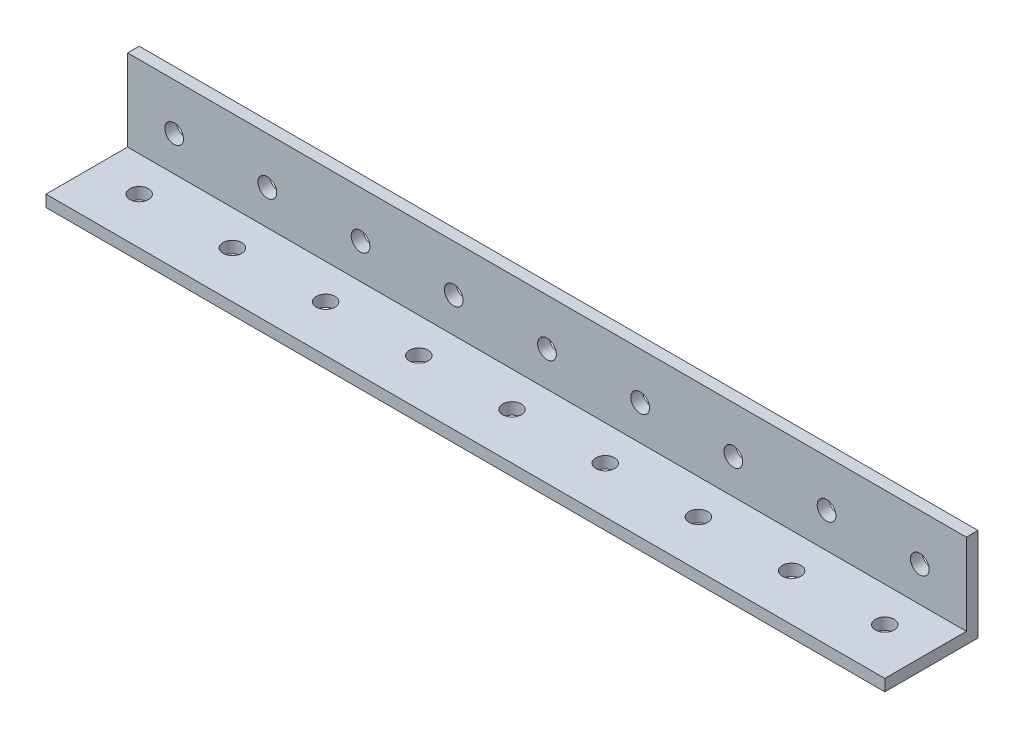
ISO-10303-21;
HEADER;
FILE_DESCRIPTION(('STEP AP214'),'2;1');
FILE_NAME('part.step','',(''),(''),'','','');
FILE_SCHEMA(('AUTOMOTIVE_DESIGN { 1 0 10303 214 1 1 1 1 }'));
ENDSEC;
DATA;
#1=APPLICATION_CONTEXT('core data for automotive mechanical design processes');
#2=APPLICATION_PROTOCOL_DEFINITION('international standard','automotive_design',2000,#1);
#3=PRODUCT_CONTEXT('',#1,'mechanical');
#4=PRODUCT('Part','Part','',(#3));
#5=PRODUCT_RELATED_PRODUCT_CATEGORY('part','',(#4));
#6=PRODUCT_DEFINITION_FORMATION('','',#4);
#7=PRODUCT_DEFINITION_CONTEXT('part definition',#1,'design');
#8=PRODUCT_DEFINITION('design','',#6,#7);
#9=PRODUCT_DEFINITION_SHAPE('','',#8);
#10=(LENGTH_UNIT() NAMED_UNIT(*) SI_UNIT(.MILLI.,.METRE.));
#11=(NAMED_UNIT(*) PLANE_ANGLE_UNIT() SI_UNIT($,.RADIAN.));
#12=(NAMED_UNIT(*) SI_UNIT($,.STERADIAN.) SOLID_ANGLE_UNIT());
#13=UNCERTAINTY_MEASURE_WITH_UNIT(LENGTH_MEASURE(1.E-05),#10,'distance_accuracy_value','');
#14=(GEOMETRIC_REPRESENTATION_CONTEXT(3) GLOBAL_UNCERTAINTY_ASSIGNED_CONTEXT((#13)) GLOBAL_UNIT_ASSIGNED_CONTEXT((#10,
#11,#12)) REPRESENTATION_CONTEXT('',''));
#15=CARTESIAN_POINT('',(0.,0.,0.));
#16=DIRECTION('',(0.,0.,1.));
#17=DIRECTION('',(1.,0.,0.));
#18=AXIS2_PLACEMENT_3D('',#15,#16,#17);
#19=CARTESIAN_POINT('',(12.7,88.9,25.4));
#20=DIRECTION('',(0.,0.,-1.));
#21=DIRECTION('',(-1.,0.,0.));
#22=AXIS2_PLACEMENT_3D('',#19,#20,#21);
#23=CYLINDRICAL_SURFACE('',#22,2.5527);
#24=CARTESIAN_POINT('',(12.7,88.9,0.));
#25=DIRECTION('',(0.,0.,1.));
#26=DIRECTION('',(1.,0.,0.));
#27=AXIS2_PLACEMENT_3D('',#24,#25,#26);
#28=CIRCLE('',#27,2.5527);
#29=CARTESIAN_POINT('',(15.2527,88.9,0.));
#30=VERTEX_POINT('',#29);
#31=EDGE_CURVE('E265',#30,#30,#28,.T.);
#32=ORIENTED_EDGE('',*,*,#31,.F.);
#33=EDGE_LOOP('',(#32));
#34=FACE_BOUND('',#33,.T.);
#35=CARTESIAN_POINT('',(12.7,88.9,3.175));
#36=DIRECTION('',(0.,0.,-1.));
#37=DIRECTION('',(1.,0.,0.));
#38=AXIS2_PLACEMENT_3D('',#35,#36,#37);
#39=CIRCLE('',#38,2.5527);
#40=CARTESIAN_POINT('',(15.2527,88.9,3.175));
#41=VERTEX_POINT('',#40);
#42=EDGE_CURVE('E403',#41,#41,#39,.T.);
#43=ORIENTED_EDGE('',*,*,#42,.F.);
#44=EDGE_LOOP('',(#43));
#45=FACE_BOUND('',#44,.T.);
#46=ADVANCED_FACE('F17',(#34,#45),#23,.F.);
#47=CARTESIAN_POINT('',(38.1,88.9,25.4));
#48=DIRECTION('',(0.,0.,-1.));
#49=DIRECTION('',(-1.,0.,0.));
#50=AXIS2_PLACEMENT_3D('',#47,#48,#49);
#51=CYLINDRICAL_SURFACE('',#50,2.5527);
#52=CARTESIAN_POINT('',(38.1,88.9,0.));
#53=DIRECTION('',(0.,0.,1.));
#54=DIRECTION('',(1.,0.,0.));
#55=AXIS2_PLACEMENT_3D('',#52,#53,#54);
#56=CIRCLE('',#55,2.5527);
#57=CARTESIAN_POINT('',(40.6527,88.9,0.));
#58=VERTEX_POINT('',#57);
#59=EDGE_CURVE('E261',#58,#58,#56,.T.);
#60=ORIENTED_EDGE('',*,*,#59,.F.);
#61=EDGE_LOOP('',(#60));
#62=FACE_BOUND('',#61,.T.);
#63=CARTESIAN_POINT('',(38.1,88.9,3.175));
#64=DIRECTION('',(0.,0.,-1.));
#65=DIRECTION('',(1.,0.,0.));
#66=AXIS2_PLACEMENT_3D('',#63,#64,#65);
#67=CIRCLE('',#66,2.5527);
#68=CARTESIAN_POINT('',(40.6527,88.9,3.175));
#69=VERTEX_POINT('',#68);
#70=EDGE_CURVE('E400',#69,#69,#67,.T.);
#71=ORIENTED_EDGE('',*,*,#70,.F.);
#72=EDGE_LOOP('',(#71));
#73=FACE_BOUND('',#72,.T.);
#74=ADVANCED_FACE('F415',(#62,#73),#51,.F.);
#75=CARTESIAN_POINT('',(63.5,88.9,25.4));
#76=DIRECTION('',(0.,0.,-1.));
#77=DIRECTION('',(-1.,0.,0.));
#78=AXIS2_PLACEMENT_3D('',#75,#76,#77);
#79=CYLINDRICAL_SURFACE('',#78,2.5527);
#80=CARTESIAN_POINT('',(63.5,88.9,0.));
#81=DIRECTION('',(0.,0.,1.));
#82=DIRECTION('',(1.,0.,0.));
#83=AXIS2_PLACEMENT_3D('',#80,#81,#82);
#84=CIRCLE('',#83,2.5527);
#85=CARTESIAN_POINT('',(66.0527,88.9,0.));
#86=VERTEX_POINT('',#85);
#87=EDGE_CURVE('E264',#86,#86,#84,.T.);
#88=ORIENTED_EDGE('',*,*,#87,.F.);
#89=EDGE_LOOP('',(#88));
#90=FACE_BOUND('',#89,.T.);
#91=CARTESIAN_POINT('',(63.5,88.9,3.175));
#92=DIRECTION('',(0.,0.,-1.));
#93=DIRECTION('',(1.,0.,0.));
#94=AXIS2_PLACEMENT_3D('',#91,#92,#93);
#95=CIRCLE('',#94,2.5527);
#96=CARTESIAN_POINT('',(66.0527,88.9,3.175));
#97=VERTEX_POINT('',#96);
#98=EDGE_CURVE('E397',#97,#97,#95,.T.);
#99=ORIENTED_EDGE('',*,*,#98,.F.);
#100=EDGE_LOOP('',(#99));
#101=FACE_BOUND('',#100,.T.);
#102=ADVANCED_FACE('F19',(#90,#101),#79,.F.);
#103=CARTESIAN_POINT('',(88.9,88.9,25.4));
#104=DIRECTION('',(0.,0.,-1.));
#105=DIRECTION('',(-1.,0.,0.));
#106=AXIS2_PLACEMENT_3D('',#103,#104,#105);
#107=CYLINDRICAL_SURFACE('',#106,2.5527);
#108=CARTESIAN_POINT('',(88.9,88.9,0.));
#109=DIRECTION('',(0.,0.,1.));
#110=DIRECTION('',(1.,0.,0.));
#111=AXIS2_PLACEMENT_3D('',#108,#109,#110);
#112=CIRCLE('',#111,2.5527);
#113=CARTESIAN_POINT('',(91.4527,88.9,0.));
#114=VERTEX_POINT('',#113);
#115=EDGE_CURVE('E270',#114,#114,#112,.T.);
#116=ORIENTED_EDGE('',*,*,#115,.F.);
#117=EDGE_LOOP('',(#116));
#118=FACE_BOUND('',#117,.T.);
#119=CARTESIAN_POINT('',(88.9,88.9,3.175));
#120=DIRECTION('',(0.,0.,-1.));
#121=DIRECTION('',(1.,0.,0.));
#122=AXIS2_PLACEMENT_3D('',#119,#120,#121);
#123=CIRCLE('',#122,2.5527);
#124=CARTESIAN_POINT('',(91.4527,88.9,3.175));
#125=VERTEX_POINT('',#124);
#126=EDGE_CURVE('E390',#125,#125,#123,.T.);
#127=ORIENTED_EDGE('',*,*,#126,.F.);
#128=EDGE_LOOP('',(#127));
#129=FACE_BOUND('',#128,.T.);
#130=ADVANCED_FACE('F441',(#118,#129),#107,.F.);
#131=CARTESIAN_POINT('',(114.3,88.9,25.4));
#132=DIRECTION('',(0.,0.,-1.));
#133=DIRECTION('',(-1.,0.,0.));
#134=AXIS2_PLACEMENT_3D('',#131,#132,#133);
#135=CYLINDRICAL_SURFACE('',#134,2.5527);
#136=CARTESIAN_POINT('',(114.3,88.9,0.));
#137=DIRECTION('',(0.,0.,1.));
#138=DIRECTION('',(1.,0.,0.));
#139=AXIS2_PLACEMENT_3D('',#136,#137,#138);
#140=CIRCLE('',#139,2.5527);
#141=CARTESIAN_POINT('',(116.8527,88.9,0.));
#142=VERTEX_POINT('',#141);
#143=EDGE_CURVE('E273',#142,#142,#140,.T.);
#144=ORIENTED_EDGE('',*,*,#143,.F.);
#145=EDGE_LOOP('',(#144));
#146=FACE_BOUND('',#145,.T.);
#147=CARTESIAN_POINT('',(114.3,88.9,3.175));
#148=DIRECTION('',(0.,0.,-1.));
#149=DIRECTION('',(1.,0.,0.));
#150=AXIS2_PLACEMENT_3D('',#147,#148,#149);
#151=CIRCLE('',#150,2.5527);
#152=CARTESIAN_POINT('',(116.8527,88.9,3.175));
#153=VERTEX_POINT('',#152);
#154=EDGE_CURVE('E387',#153,#153,#151,.T.);
#155=ORIENTED_EDGE('',*,*,#154,.F.);
#156=EDGE_LOOP('',(#155));
#157=FACE_BOUND('',#156,.T.);
#158=ADVANCED_FACE('F437',(#146,#157),#135,.F.);
#159=CARTESIAN_POINT('',(139.7,88.9,25.4));
#160=DIRECTION('',(0.,0.,-1.));
#161=DIRECTION('',(-1.,0.,0.));
#162=AXIS2_PLACEMENT_3D('',#159,#160,#161);
#163=CYLINDRICAL_SURFACE('',#162,2.5527);
#164=CARTESIAN_POINT('',(139.7,88.9,0.));
#165=DIRECTION('',(0.,0.,1.));
#166=DIRECTION('',(1.,0.,0.));
#167=AXIS2_PLACEMENT_3D('',#164,#165,#166);
#168=CIRCLE('',#167,2.5527);
#169=CARTESIAN_POINT('',(142.2527,88.9,0.));
#170=VERTEX_POINT('',#169);
#171=EDGE_CURVE('E260',#170,#170,#168,.T.);
#172=ORIENTED_EDGE('',*,*,#171,.F.);
#173=EDGE_LOOP('',(#172));
#174=FACE_BOUND('',#173,.T.);
#175=CARTESIAN_POINT('',(139.7,88.9,3.175));
#176=DIRECTION('',(0.,0.,-1.));
#177=DIRECTION('',(1.,0.,0.));
#178=AXIS2_PLACEMENT_3D('',#175,#176,#177);
#179=CIRCLE('',#178,2.5527);
#180=CARTESIAN_POINT('',(142.2527,88.9,3.175));
#181=VERTEX_POINT('',#180);
#182=EDGE_CURVE('E384',#181,#181,#179,.T.);
#183=ORIENTED_EDGE('',*,*,#182,.F.);
#184=EDGE_LOOP('',(#183));
#185=FACE_BOUND('',#184,.T.);
#186=ADVANCED_FACE('F440',(#174,#185),#163,.F.);
#187=CARTESIAN_POINT('',(165.1,88.9,25.4));
#188=DIRECTION('',(0.,0.,-1.));
#189=DIRECTION('',(-1.,0.,0.));
#190=AXIS2_PLACEMENT_3D('',#187,#188,#189);
#191=CYLINDRICAL_SURFACE('',#190,2.5527);
#192=CARTESIAN_POINT('',(165.1,88.9,0.));
#193=DIRECTION('',(0.,0.,1.));
#194=DIRECTION('',(1.,0.,0.));
#195=AXIS2_PLACEMENT_3D('',#192,#193,#194);
#196=CIRCLE('',#195,2.5527);
#197=CARTESIAN_POINT('',(167.6527,88.9,0.));
#198=VERTEX_POINT('',#197);
#199=EDGE_CURVE('E256',#198,#198,#196,.T.);
#200=ORIENTED_EDGE('',*,*,#199,.F.);
#201=EDGE_LOOP('',(#200));
#202=FACE_BOUND('',#201,.T.);
#203=CARTESIAN_POINT('',(165.1,88.9,3.175));
#204=DIRECTION('',(0.,0.,-1.));
#205=DIRECTION('',(1.,0.,0.));
#206=AXIS2_PLACEMENT_3D('',#203,#204,#205);
#207=CIRCLE('',#206,2.5527);
#208=CARTESIAN_POINT('',(167.6527,88.9,3.175));
#209=VERTEX_POINT('',#208);
#210=EDGE_CURVE('E381',#209,#209,#207,.T.);
#211=ORIENTED_EDGE('',*,*,#210,.F.);
#212=EDGE_LOOP('',(#211));
#213=FACE_BOUND('',#212,.T.);
#214=ADVANCED_FACE('F478',(#202,#213),#191,.F.);
#215=CARTESIAN_POINT('',(190.5,88.9,25.4));
#216=DIRECTION('',(0.,0.,-1.));
#217=DIRECTION('',(-1.,0.,0.));
#218=AXIS2_PLACEMENT_3D('',#215,#216,#217);
#219=CYLINDRICAL_SURFACE('',#218,2.5527);
#220=CARTESIAN_POINT('',(190.5,88.9,0.));
#221=DIRECTION('',(0.,0.,1.));
#222=DIRECTION('',(1.,0.,0.));
#223=AXIS2_PLACEMENT_3D('',#220,#221,#222);
#224=CIRCLE('',#223,2.5527);
#225=CARTESIAN_POINT('',(193.0527,88.9,0.));
#226=VERTEX_POINT('',#225);
#227=EDGE_CURVE('E259',#226,#226,#224,.T.);
#228=ORIENTED_EDGE('',*,*,#227,.F.);
#229=EDGE_LOOP('',(#228));
#230=FACE_BOUND('',#229,.T.);
#231=CARTESIAN_POINT('',(190.5,88.9,3.175));
#232=DIRECTION('',(0.,0.,-1.));
#233=DIRECTION('',(1.,0.,0.));
#234=AXIS2_PLACEMENT_3D('',#231,#232,#233);
#235=CIRCLE('',#234,2.5527);
#236=CARTESIAN_POINT('',(193.0527,88.9,3.175));
#237=VERTEX_POINT('',#236);
#238=EDGE_CURVE('E376',#237,#237,#235,.T.);
#239=ORIENTED_EDGE('',*,*,#238,.F.);
#240=EDGE_LOOP('',(#239));
#241=FACE_BOUND('',#240,.T.);
#242=ADVANCED_FACE('F474',(#230,#241),#219,.F.);
#243=CARTESIAN_POINT('',(215.9,88.9,25.4));
#244=DIRECTION('',(0.,0.,-1.));
#245=DIRECTION('',(-1.,0.,0.));
#246=AXIS2_PLACEMENT_3D('',#243,#244,#245);
#247=CYLINDRICAL_SURFACE('',#246,2.5527);
#248=CARTESIAN_POINT('',(215.9,88.9,0.));
#249=DIRECTION('',(0.,0.,1.));
#250=DIRECTION('',(1.,0.,0.));
#251=AXIS2_PLACEMENT_3D('',#248,#249,#250);
#252=CIRCLE('',#251,2.5527);
#253=CARTESIAN_POINT('',(218.4527,88.9,0.));
#254=VERTEX_POINT('',#253);
#255=EDGE_CURVE('E278',#254,#254,#252,.T.);
#256=ORIENTED_EDGE('',*,*,#255,.F.);
#257=EDGE_LOOP('',(#256));
#258=FACE_BOUND('',#257,.T.);
#259=CARTESIAN_POINT('',(215.9,88.9,3.175));
#260=DIRECTION('',(0.,0.,-1.));
#261=DIRECTION('',(1.,0.,0.));
#262=AXIS2_PLACEMENT_3D('',#259,#260,#261);
#263=CIRCLE('',#262,2.5527);
#264=CARTESIAN_POINT('',(218.4527,88.9,3.175));
#265=VERTEX_POINT('',#264);
#266=EDGE_CURVE('E373',#265,#265,#263,.T.);
#267=ORIENTED_EDGE('',*,*,#266,.F.);
#268=EDGE_LOOP('',(#267));
#269=FACE_BOUND('',#268,.T.);
#270=ADVANCED_FACE('F470',(#258,#269),#247,.F.);
#271=CARTESIAN_POINT('',(12.7,1126.04930693996,12.7));
#272=DIRECTION('',(0.,-1.,0.));
#273=DIRECTION('',(0.,0.,-1.));
#274=AXIS2_PLACEMENT_3D('',#271,#272,#273);
#275=CYLINDRICAL_SURFACE('',#274,2.5527);
#276=CARTESIAN_POINT('',(12.7,79.375,12.7));
#277=DIRECTION('',(0.,-1.,0.));
#278=DIRECTION('',(0.,0.,-1.));
#279=AXIS2_PLACEMENT_3D('',#276,#277,#278);
#280=CIRCLE('',#279,2.5527);
#281=CARTESIAN_POINT('',(12.7,79.375,10.1473));
#282=VERTEX_POINT('',#281);
#283=EDGE_CURVE('E352',#282,#282,#280,.T.);
#284=ORIENTED_EDGE('',*,*,#283,.F.);
#285=EDGE_LOOP('',(#284));
#286=FACE_BOUND('',#285,.T.);
#287=CARTESIAN_POINT('',(12.7,76.2,12.7));
#288=DIRECTION('',(0.,-1.,0.));
#289=DIRECTION('',(0.,0.,-1.));
#290=AXIS2_PLACEMENT_3D('',#287,#288,#289);
#291=CIRCLE('',#290,2.5527);
#292=CARTESIAN_POINT('',(12.7,76.2,10.1473));
#293=VERTEX_POINT('',#292);
#294=EDGE_CURVE('E310',#293,#293,#291,.T.);
#295=ORIENTED_EDGE('',*,*,#294,.T.);
#296=EDGE_LOOP('',(#295));
#297=FACE_BOUND('',#296,.T.);
#298=ADVANCED_FACE('F466',(#286,#297),#275,.F.);
#299=CARTESIAN_POINT('',(38.1,1126.04930693996,12.7));
#300=DIRECTION('',(0.,-1.,0.));
#301=DIRECTION('',(0.,0.,-1.));
#302=AXIS2_PLACEMENT_3D('',#299,#300,#301);
#303=CYLINDRICAL_SURFACE('',#302,2.5527);
#304=CARTESIAN_POINT('',(38.1,79.375,12.7));
#305=DIRECTION('',(0.,-1.,0.));
#306=DIRECTION('',(0.,0.,-1.));
#307=AXIS2_PLACEMENT_3D('',#304,#305,#306);
#308=CIRCLE('',#307,2.5527);
#309=CARTESIAN_POINT('',(38.1,79.375,10.1473));
#310=VERTEX_POINT('',#309);
#311=EDGE_CURVE('E349',#310,#310,#308,.T.);
#312=ORIENTED_EDGE('',*,*,#311,.F.);
#313=EDGE_LOOP('',(#312));
#314=FACE_BOUND('',#313,.T.);
#315=CARTESIAN_POINT('',(38.1,76.2,12.7));
#316=DIRECTION('',(0.,-1.,0.));
#317=DIRECTION('',(0.,0.,-1.));
#318=AXIS2_PLACEMENT_3D('',#315,#316,#317);
#319=CIRCLE('',#318,2.5527);
#320=CARTESIAN_POINT('',(38.1,76.2,10.1473));
#321=VERTEX_POINT('',#320);
#322=EDGE_CURVE('E313',#321,#321,#319,.T.);
#323=ORIENTED_EDGE('',*,*,#322,.T.);
#324=EDGE_LOOP('',(#323));
#325=FACE_BOUND('',#324,.T.);
#326=ADVANCED_FACE('F469',(#314,#325),#303,.F.);
#327=CARTESIAN_POINT('',(63.5,1126.04930693996,12.7));
#328=DIRECTION('',(0.,-1.,0.));
#329=DIRECTION('',(0.,0.,-1.));
#330=AXIS2_PLACEMENT_3D('',#327,#328,#329);
#331=CYLINDRICAL_SURFACE('',#330,2.5527);
#332=CARTESIAN_POINT('',(63.5,79.375,12.7));
#333=DIRECTION('',(0.,-1.,0.));
#334=DIRECTION('',(0.,0.,-1.));
#335=AXIS2_PLACEMENT_3D('',#332,#333,#334);
#336=CIRCLE('',#335,2.5527);
#337=CARTESIAN_POINT('',(63.5,79.375,10.1473));
#338=VERTEX_POINT('',#337);
#339=EDGE_CURVE('E348',#338,#338,#336,.T.);
#340=ORIENTED_EDGE('',*,*,#339,.F.);
#341=EDGE_LOOP('',(#340));
#342=FACE_BOUND('',#341,.T.);
#343=CARTESIAN_POINT('',(63.5,76.2,12.7));
#344=DIRECTION('',(0.,-1.,0.));
#345=DIRECTION('',(0.,0.,-1.));
#346=AXIS2_PLACEMENT_3D('',#343,#344,#345);
#347=CIRCLE('',#346,2.5527);
#348=CARTESIAN_POINT('',(63.5,76.2,10.1473));
#349=VERTEX_POINT('',#348);
#350=EDGE_CURVE('E316',#349,#349,#347,.T.);
#351=ORIENTED_EDGE('',*,*,#350,.T.);
#352=EDGE_LOOP('',(#351));
#353=FACE_BOUND('',#352,.T.);
#354=ADVANCED_FACE('F427',(#342,#353),#331,.F.);
#355=CARTESIAN_POINT('',(88.9,1126.04930693996,12.7));
#356=DIRECTION('',(0.,-1.,0.));
#357=DIRECTION('',(0.,0.,-1.));
#358=AXIS2_PLACEMENT_3D('',#355,#356,#357);
#359=CYLINDRICAL_SURFACE('',#358,2.5527);
#360=CARTESIAN_POINT('',(88.9,79.375,12.7));
#361=DIRECTION('',(0.,-1.,0.));
#362=DIRECTION('',(0.,0.,-1.));
#363=AXIS2_PLACEMENT_3D('',#360,#361,#362);
#364=CIRCLE('',#363,2.5527);
#365=CARTESIAN_POINT('',(88.9,79.375,10.1473));
#366=VERTEX_POINT('',#365);
#367=EDGE_CURVE('E344',#366,#366,#364,.T.);
#368=ORIENTED_EDGE('',*,*,#367,.F.);
#369=EDGE_LOOP('',(#368));
#370=FACE_BOUND('',#369,.T.);
#371=CARTESIAN_POINT('',(88.9,76.2,12.7));
#372=DIRECTION('',(0.,-1.,0.));
#373=DIRECTION('',(0.,0.,-1.));
#374=AXIS2_PLACEMENT_3D('',#371,#372,#373);
#375=CIRCLE('',#374,2.5527);
#376=CARTESIAN_POINT('',(88.9,76.2,10.1473));
#377=VERTEX_POINT('',#376);
#378=EDGE_CURVE('E318',#377,#377,#375,.T.);
#379=ORIENTED_EDGE('',*,*,#378,.T.);
#380=EDGE_LOOP('',(#379));
#381=FACE_BOUND('',#380,.T.);
#382=ADVANCED_FACE('F459',(#370,#381),#359,.F.);
#383=CARTESIAN_POINT('',(114.3,1126.04930693996,12.7));
#384=DIRECTION('',(0.,-1.,0.));
#385=DIRECTION('',(0.,0.,-1.));
#386=AXIS2_PLACEMENT_3D('',#383,#384,#385);
#387=CYLINDRICAL_SURFACE('',#386,2.5527);
#388=CARTESIAN_POINT('',(114.3,79.375,12.7));
#389=DIRECTION('',(0.,-1.,0.));
#390=DIRECTION('',(0.,0.,-1.));
#391=AXIS2_PLACEMENT_3D('',#388,#389,#390);
#392=CIRCLE('',#391,2.5527);
#393=CARTESIAN_POINT('',(114.3,79.375,10.1473));
#394=VERTEX_POINT('',#393);
#395=EDGE_CURVE('E347',#394,#394,#392,.T.);
#396=ORIENTED_EDGE('',*,*,#395,.F.);
#397=EDGE_LOOP('',(#396));
#398=FACE_BOUND('',#397,.T.);
#399=CARTESIAN_POINT('',(114.3,76.2,12.7));
#400=DIRECTION('',(0.,-1.,0.));
#401=DIRECTION('',(0.,0.,-1.));
#402=AXIS2_PLACEMENT_3D('',#399,#400,#401);
#403=CIRCLE('',#402,2.5527);
#404=CARTESIAN_POINT('',(114.3,76.2,10.1473));
#405=VERTEX_POINT('',#404);
#406=EDGE_CURVE('E319',#405,#405,#403,.T.);
#407=ORIENTED_EDGE('',*,*,#406,.T.);
#408=EDGE_LOOP('',(#407));
#409=FACE_BOUND('',#408,.T.);
#410=ADVANCED_FACE('F457',(#398,#409),#387,.F.);
#411=CARTESIAN_POINT('',(139.7,1126.04930693996,12.7));
#412=DIRECTION('',(0.,-1.,0.));
#413=DIRECTION('',(0.,0.,-1.));
#414=AXIS2_PLACEMENT_3D('',#411,#412,#413);
#415=CYLINDRICAL_SURFACE('',#414,2.5527);
#416=CARTESIAN_POINT('',(139.7,79.375,12.7));
#417=DIRECTION('',(0.,-1.,0.));
#418=DIRECTION('',(0.,0.,-1.));
#419=AXIS2_PLACEMENT_3D('',#416,#417,#418);
#420=CIRCLE('',#419,2.5527);
#421=CARTESIAN_POINT('',(139.7,79.375,10.1473));
#422=VERTEX_POINT('',#421);
#423=EDGE_CURVE('E343',#422,#422,#420,.T.);
#424=ORIENTED_EDGE('',*,*,#423,.F.);
#425=EDGE_LOOP('',(#424));
#426=FACE_BOUND('',#425,.T.);
#427=CARTESIAN_POINT('',(139.7,76.2,12.7));
#428=DIRECTION('',(0.,-1.,0.));
#429=DIRECTION('',(0.,0.,-1.));
#430=AXIS2_PLACEMENT_3D('',#427,#428,#429);
#431=CIRCLE('',#430,2.5527);
#432=CARTESIAN_POINT('',(139.7,76.2,10.1473));
#433=VERTEX_POINT('',#432);
#434=EDGE_CURVE('E244',#433,#433,#431,.T.);
#435=ORIENTED_EDGE('',*,*,#434,.T.);
#436=EDGE_LOOP('',(#435));
#437=FACE_BOUND('',#436,.T.);
#438=ADVANCED_FACE('F450',(#426,#437),#415,.F.);
#439=CARTESIAN_POINT('',(165.1,1126.04930693996,12.7));
#440=DIRECTION('',(0.,-1.,0.));
#441=DIRECTION('',(0.,0.,-1.));
#442=AXIS2_PLACEMENT_3D('',#439,#440,#441);
#443=CYLINDRICAL_SURFACE('',#442,2.5527);
#444=CARTESIAN_POINT('',(165.1,79.375,12.7));
#445=DIRECTION('',(0.,-1.,0.));
#446=DIRECTION('',(0.,0.,-1.));
#447=AXIS2_PLACEMENT_3D('',#444,#445,#446);
#448=CIRCLE('',#447,2.5527);
#449=CARTESIAN_POINT('',(165.1,79.375,10.1473));
#450=VERTEX_POINT('',#449);
#451=EDGE_CURVE('E340',#450,#450,#448,.T.);
#452=ORIENTED_EDGE('',*,*,#451,.F.);
#453=EDGE_LOOP('',(#452));
#454=FACE_BOUND('',#453,.T.);
#455=CARTESIAN_POINT('',(165.1,76.2,12.7));
#456=DIRECTION('',(0.,-1.,0.));
#457=DIRECTION('',(0.,0.,-1.));
#458=AXIS2_PLACEMENT_3D('',#455,#456,#457);
#459=CIRCLE('',#458,2.5527);
#460=CARTESIAN_POINT('',(165.1,76.2,10.1473));
#461=VERTEX_POINT('',#460);
#462=EDGE_CURVE('E236',#461,#461,#459,.T.);
#463=ORIENTED_EDGE('',*,*,#462,.T.);
#464=EDGE_LOOP('',(#463));
#465=FACE_BOUND('',#464,.T.);
#466=ADVANCED_FACE('F447',(#454,#465),#443,.F.);
#467=CARTESIAN_POINT('',(190.5,1126.04930693996,12.7));
#468=DIRECTION('',(0.,-1.,0.));
#469=DIRECTION('',(0.,0.,-1.));
#470=AXIS2_PLACEMENT_3D('',#467,#468,#469);
#471=CYLINDRICAL_SURFACE('',#470,2.5527);
#472=CARTESIAN_POINT('',(190.5,79.375,12.7));
#473=DIRECTION('',(0.,-1.,0.));
#474=DIRECTION('',(0.,0.,-1.));
#475=AXIS2_PLACEMENT_3D('',#472,#473,#474);
#476=CIRCLE('',#475,2.5527);
#477=CARTESIAN_POINT('',(190.5,79.375,10.1473));
#478=VERTEX_POINT('',#477);
#479=EDGE_CURVE('E337',#478,#478,#476,.T.);
#480=ORIENTED_EDGE('',*,*,#479,.F.);
#481=EDGE_LOOP('',(#480));
#482=FACE_BOUND('',#481,.T.);
#483=CARTESIAN_POINT('',(190.5,76.2,12.7));
#484=DIRECTION('',(0.,-1.,0.));
#485=DIRECTION('',(0.,0.,-1.));
#486=AXIS2_PLACEMENT_3D('',#483,#484,#485);
#487=CIRCLE('',#486,2.5527);
#488=CARTESIAN_POINT('',(190.5,76.2,10.1473));
#489=VERTEX_POINT('',#488);
#490=EDGE_CURVE('E231',#489,#489,#487,.T.);
#491=ORIENTED_EDGE('',*,*,#490,.T.);
#492=EDGE_LOOP('',(#491));
#493=FACE_BOUND('',#492,.T.);
#494=ADVANCED_FACE('F232',(#482,#493),#471,.F.);
#495=CARTESIAN_POINT('',(215.9,1126.04930693996,12.7));
#496=DIRECTION('',(0.,-1.,0.));
#497=DIRECTION('',(0.,0.,-1.));
#498=AXIS2_PLACEMENT_3D('',#495,#496,#497);
#499=CYLINDRICAL_SURFACE('',#498,2.5527);
#500=CARTESIAN_POINT('',(215.9,79.375,12.7));
#501=DIRECTION('',(0.,-1.,0.));
#502=DIRECTION('',(0.,0.,-1.));
#503=AXIS2_PLACEMENT_3D('',#500,#501,#502);
#504=CIRCLE('',#503,2.5527);
#505=CARTESIAN_POINT('',(215.9,79.375,10.1473));
#506=VERTEX_POINT('',#505);
#507=EDGE_CURVE('E334',#506,#506,#504,.T.);
#508=ORIENTED_EDGE('',*,*,#507,.F.);
#509=EDGE_LOOP('',(#508));
#510=FACE_BOUND('',#509,.T.);
#511=CARTESIAN_POINT('',(215.9,76.2,12.7));
#512=DIRECTION('',(0.,-1.,0.));
#513=DIRECTION('',(0.,0.,-1.));
#514=AXIS2_PLACEMENT_3D('',#511,#512,#513);
#515=CIRCLE('',#514,2.5527);
#516=CARTESIAN_POINT('',(215.9,76.2,10.1473));
#517=VERTEX_POINT('',#516);
#518=EDGE_CURVE('E235',#517,#517,#515,.T.);
#519=ORIENTED_EDGE('',*,*,#518,.T.);
#520=EDGE_LOOP('',(#519));
#521=FACE_BOUND('',#520,.T.);
#522=ADVANCED_FACE('F443',(#510,#521),#499,.F.);
#523=CARTESIAN_POINT('',(0.,50.8,12.7));
#524=DIRECTION('',(1.,0.,0.));
#525=DIRECTION('',(0.,1.,0.));
#526=AXIS2_PLACEMENT_3D('',#523,#524,#525);
#527=PLANE('',#526);
#528=DIRECTION('',(0.,1.,0.));
#529=VECTOR('',#528,1.);
#530=CARTESIAN_POINT('',(0.,90.4875,3.175));
#531=LINE('',#530,#529);
#532=CARTESIAN_POINT('',(0.,79.375,3.175));
#533=VERTEX_POINT('',#532);
#534=CARTESIAN_POINT('',(0.,101.6,3.175));
#535=VERTEX_POINT('',#534);
#536=EDGE_CURVE('E370',#533,#535,#531,.T.);
#537=ORIENTED_EDGE('',*,*,#536,.T.);
#538=DIRECTION('',(0.,0.,-1.));
#539=VECTOR('',#538,1.);
#540=CARTESIAN_POINT('',(0.,101.6,1.5875));
#541=LINE('',#540,#539);
#542=CARTESIAN_POINT('',(0.,101.6,0.));
#543=VERTEX_POINT('',#542);
#544=EDGE_CURVE('E27',#535,#543,#541,.T.);
#545=ORIENTED_EDGE('',*,*,#544,.T.);
#546=DIRECTION('',(0.,1.,0.));
#547=VECTOR('',#546,1.);
#548=CARTESIAN_POINT('',(0.,88.9,0.));
#549=LINE('',#548,#547);
#550=CARTESIAN_POINT('',(0.,76.2,0.));
#551=VERTEX_POINT('',#550);
#552=EDGE_CURVE('E280',#551,#543,#549,.T.);
#553=ORIENTED_EDGE('',*,*,#552,.F.);
#554=DIRECTION('',(0.,0.,1.));
#555=VECTOR('',#554,1.);
#556=CARTESIAN_POINT('',(0.,76.2,12.7));
#557=LINE('',#556,#555);
#558=CARTESIAN_POINT('',(0.,76.2,25.4));
#559=VERTEX_POINT('',#558);
#560=EDGE_CURVE('E241',#551,#559,#557,.T.);
#561=ORIENTED_EDGE('',*,*,#560,.T.);
#562=DIRECTION('',(0.,-1.,0.));
#563=VECTOR('',#562,1.);
#564=CARTESIAN_POINT('',(0.,77.7875,25.4));
#565=LINE('',#564,#563);
#566=CARTESIAN_POINT('',(0.,79.375,25.4));
#567=VERTEX_POINT('',#566);
#568=EDGE_CURVE('E297',#567,#559,#565,.T.);
#569=ORIENTED_EDGE('',*,*,#568,.F.);
#570=DIRECTION('',(0.,0.,1.));
#571=VECTOR('',#570,1.);
#572=CARTESIAN_POINT('',(0.,79.375,14.2875));
#573=LINE('',#572,#571);
#574=EDGE_CURVE('E333',#533,#567,#573,.T.);
#575=ORIENTED_EDGE('',*,*,#574,.F.);
#576=EDGE_LOOP('',(#537,#545,#553,#561,#569,#575));
#577=FACE_BOUND('',#576,.T.);
#578=ADVANCED_FACE('F435',(#577),#527,.F.);
#579=CARTESIAN_POINT('',(228.6,50.8,12.7));
#580=DIRECTION('',(1.,0.,0.));
#581=DIRECTION('',(0.,1.,0.));
#582=AXIS2_PLACEMENT_3D('',#579,#580,#581);
#583=PLANE('',#582);
#584=DIRECTION('',(0.,1.,0.));
#585=VECTOR('',#584,1.);
#586=CARTESIAN_POINT('',(228.6,90.4875,3.175));
#587=LINE('',#586,#585);
#588=CARTESIAN_POINT('',(228.6,79.375,3.175));
#589=VERTEX_POINT('',#588);
#590=CARTESIAN_POINT('',(228.6,101.6,3.175));
#591=VERTEX_POINT('',#590);
#592=EDGE_CURVE('E359',#589,#591,#587,.T.);
#593=ORIENTED_EDGE('',*,*,#592,.F.);
#594=DIRECTION('',(0.,0.,1.));
#595=VECTOR('',#594,1.);
#596=CARTESIAN_POINT('',(228.6,79.375,14.2875));
#597=LINE('',#596,#595);
#598=CARTESIAN_POINT('',(228.6,79.375,25.4));
#599=VERTEX_POINT('',#598);
#600=EDGE_CURVE('E295',#589,#599,#597,.T.);
#601=ORIENTED_EDGE('',*,*,#600,.T.);
#602=DIRECTION('',(0.,-1.,0.));
#603=VECTOR('',#602,1.);
#604=CARTESIAN_POINT('',(228.6,77.7875,25.4));
#605=LINE('',#604,#603);
#606=CARTESIAN_POINT('',(228.6,76.2,25.4));
#607=VERTEX_POINT('',#606);
#608=EDGE_CURVE('E304',#599,#607,#605,.T.);
#609=ORIENTED_EDGE('',*,*,#608,.T.);
#610=DIRECTION('',(0.,0.,1.));
#611=VECTOR('',#610,1.);
#612=CARTESIAN_POINT('',(228.6,76.2,12.7));
#613=LINE('',#612,#611);
#614=CARTESIAN_POINT('',(228.6,76.2,0.));
#615=VERTEX_POINT('',#614);
#616=EDGE_CURVE('E255',#615,#607,#613,.T.);
#617=ORIENTED_EDGE('',*,*,#616,.F.);
#618=DIRECTION('',(0.,1.,0.));
#619=VECTOR('',#618,1.);
#620=CARTESIAN_POINT('',(228.6,88.9,0.));
#621=LINE('',#620,#619);
#622=CARTESIAN_POINT('',(228.6,101.6,0.));
#623=VERTEX_POINT('',#622);
#624=EDGE_CURVE('E21',#615,#623,#621,.T.);
#625=ORIENTED_EDGE('',*,*,#624,.T.);
#626=DIRECTION('',(0.,0.,-1.));
#627=VECTOR('',#626,1.);
#628=CARTESIAN_POINT('',(228.6,101.6,1.5875));
#629=LINE('',#628,#627);
#630=EDGE_CURVE('E11',#591,#623,#629,.T.);
#631=ORIENTED_EDGE('',*,*,#630,.F.);
#632=EDGE_LOOP('',(#593,#601,#609,#617,#625,#631));
#633=FACE_BOUND('',#632,.T.);
#634=ADVANCED_FACE('F432',(#633),#583,.T.);
#635=CARTESIAN_POINT('',(228.6,101.6,1.5875));
#636=DIRECTION('',(0.,1.,0.));
#637=DIRECTION('',(1.,0.,0.));
#638=AXIS2_PLACEMENT_3D('',#635,#636,#637);
#639=PLANE('',#638);
#640=ORIENTED_EDGE('',*,*,#544,.F.);
#641=DIRECTION('',(-1.,0.,0.));
#642=VECTOR('',#641,1.);
#643=CARTESIAN_POINT('',(228.6,101.6,3.175));
#644=LINE('',#643,#642);
#645=EDGE_CURVE('E358',#591,#535,#644,.T.);
#646=ORIENTED_EDGE('',*,*,#645,.F.);
#647=ORIENTED_EDGE('',*,*,#630,.T.);
#648=DIRECTION('',(-1.,0.,0.));
#649=VECTOR('',#648,1.);
#650=CARTESIAN_POINT('',(228.6,101.6,0.));
#651=LINE('',#650,#649);
#652=EDGE_CURVE('E281',#623,#543,#651,.T.);
#653=ORIENTED_EDGE('',*,*,#652,.T.);
#654=EDGE_LOOP('',(#640,#646,#647,#653));
#655=FACE_BOUND('',#654,.T.);
#656=ADVANCED_FACE('F428',(#655),#639,.T.);
#657=CARTESIAN_POINT('',(228.6,88.9,0.));
#658=DIRECTION('',(0.,0.,1.));
#659=DIRECTION('',(1.,0.,0.));
#660=AXIS2_PLACEMENT_3D('',#657,#658,#659);
#661=PLANE('',#660);
#662=ORIENTED_EDGE('',*,*,#552,.T.);
#663=ORIENTED_EDGE('',*,*,#652,.F.);
#664=ORIENTED_EDGE('',*,*,#624,.F.);
#665=DIRECTION('',(-1.,0.,0.));
#666=VECTOR('',#665,1.);
#667=CARTESIAN_POINT('',(228.6,76.2,0.));
#668=LINE('',#667,#666);
#669=EDGE_CURVE('E251',#615,#551,#668,.T.);
#670=ORIENTED_EDGE('',*,*,#669,.T.);
#671=EDGE_LOOP('',(#662,#663,#664,#670));
#672=FACE_BOUND('',#671,.T.);
#673=ORIENTED_EDGE('',*,*,#255,.T.);
#674=EDGE_LOOP('',(#673));
#675=FACE_BOUND('',#674,.T.);
#676=ORIENTED_EDGE('',*,*,#227,.T.);
#677=EDGE_LOOP('',(#676));
#678=FACE_BOUND('',#677,.T.);
#679=ORIENTED_EDGE('',*,*,#199,.T.);
#680=EDGE_LOOP('',(#679));
#681=FACE_BOUND('',#680,.T.);
#682=ORIENTED_EDGE('',*,*,#171,.T.);
#683=EDGE_LOOP('',(#682));
#684=FACE_BOUND('',#683,.T.);
#685=ORIENTED_EDGE('',*,*,#143,.T.);
#686=EDGE_LOOP('',(#685));
#687=FACE_BOUND('',#686,.T.);
#688=ORIENTED_EDGE('',*,*,#115,.T.);
#689=EDGE_LOOP('',(#688));
#690=FACE_BOUND('',#689,.T.);
#691=ORIENTED_EDGE('',*,*,#87,.T.);
#692=EDGE_LOOP('',(#691));
#693=FACE_BOUND('',#692,.T.);
#694=ORIENTED_EDGE('',*,*,#59,.T.);
#695=EDGE_LOOP('',(#694));
#696=FACE_BOUND('',#695,.T.);
#697=ORIENTED_EDGE('',*,*,#31,.T.);
#698=EDGE_LOOP('',(#697));
#699=FACE_BOUND('',#698,.T.);
#700=ADVANCED_FACE('F431',(#672,#675,#678,#681,#684,#687,#690,#693,#696,#699),#661,.F.);
#701=CARTESIAN_POINT('',(228.6,76.2,12.7));
#702=DIRECTION('',(0.,-1.,0.));
#703=DIRECTION('',(0.,0.,-1.));
#704=AXIS2_PLACEMENT_3D('',#701,#702,#703);
#705=PLANE('',#704);
#706=ORIENTED_EDGE('',*,*,#560,.F.);
#707=ORIENTED_EDGE('',*,*,#669,.F.);
#708=ORIENTED_EDGE('',*,*,#616,.T.);
#709=DIRECTION('',(-1.,0.,0.));
#710=VECTOR('',#709,1.);
#711=CARTESIAN_POINT('',(228.6,76.2,25.4));
#712=LINE('',#711,#710);
#713=EDGE_CURVE('E300',#607,#559,#712,.T.);
#714=ORIENTED_EDGE('',*,*,#713,.T.);
#715=EDGE_LOOP('',(#706,#707,#708,#714));
#716=FACE_BOUND('',#715,.T.);
#717=ORIENTED_EDGE('',*,*,#518,.F.);
#718=EDGE_LOOP('',(#717));
#719=FACE_BOUND('',#718,.T.);
#720=ORIENTED_EDGE('',*,*,#490,.F.);
#721=EDGE_LOOP('',(#720));
#722=FACE_BOUND('',#721,.T.);
#723=ORIENTED_EDGE('',*,*,#462,.F.);
#724=EDGE_LOOP('',(#723));
#725=FACE_BOUND('',#724,.T.);
#726=ORIENTED_EDGE('',*,*,#434,.F.);
#727=EDGE_LOOP('',(#726));
#728=FACE_BOUND('',#727,.T.);
#729=ORIENTED_EDGE('',*,*,#406,.F.);
#730=EDGE_LOOP('',(#729));
#731=FACE_BOUND('',#730,.T.);
#732=ORIENTED_EDGE('',*,*,#378,.F.);
#733=EDGE_LOOP('',(#732));
#734=FACE_BOUND('',#733,.T.);
#735=ORIENTED_EDGE('',*,*,#350,.F.);
#736=EDGE_LOOP('',(#735));
#737=FACE_BOUND('',#736,.T.);
#738=ORIENTED_EDGE('',*,*,#322,.F.);
#739=EDGE_LOOP('',(#738));
#740=FACE_BOUND('',#739,.T.);
#741=ORIENTED_EDGE('',*,*,#294,.F.);
#742=EDGE_LOOP('',(#741));
#743=FACE_BOUND('',#742,.T.);
#744=ADVANCED_FACE('F519',(#716,#719,#722,#725,#728,#731,#734,#737,#740,#743),#705,.T.);
#745=CARTESIAN_POINT('',(228.6,77.7875,25.4));
#746=DIRECTION('',(0.,0.,-1.));
#747=DIRECTION('',(0.,-1.,0.));
#748=AXIS2_PLACEMENT_3D('',#745,#746,#747);
#749=PLANE('',#748);
#750=ORIENTED_EDGE('',*,*,#568,.T.);
#751=ORIENTED_EDGE('',*,*,#713,.F.);
#752=ORIENTED_EDGE('',*,*,#608,.F.);
#753=DIRECTION('',(-1.,0.,0.));
#754=VECTOR('',#753,1.);
#755=CARTESIAN_POINT('',(228.6,79.375,25.4));
#756=LINE('',#755,#754);
#757=EDGE_CURVE('E330',#599,#567,#756,.T.);
#758=ORIENTED_EDGE('',*,*,#757,.T.);
#759=EDGE_LOOP('',(#750,#751,#752,#758));
#760=FACE_BOUND('',#759,.T.);
#761=ADVANCED_FACE('F508',(#760),#749,.F.);
#762=CARTESIAN_POINT('',(228.6,79.375,14.2875));
#763=DIRECTION('',(0.,-1.,0.));
#764=DIRECTION('',(0.,0.,-1.));
#765=AXIS2_PLACEMENT_3D('',#762,#763,#764);
#766=PLANE('',#765);
#767=ORIENTED_EDGE('',*,*,#574,.T.);
#768=ORIENTED_EDGE('',*,*,#757,.F.);
#769=ORIENTED_EDGE('',*,*,#600,.F.);
#770=DIRECTION('',(-1.,0.,0.));
#771=VECTOR('',#770,1.);
#772=CARTESIAN_POINT('',(228.6,79.375,3.175));
#773=LINE('',#772,#771);
#774=EDGE_CURVE('E362',#589,#533,#773,.T.);
#775=ORIENTED_EDGE('',*,*,#774,.T.);
#776=EDGE_LOOP('',(#767,#768,#769,#775));
#777=FACE_BOUND('',#776,.T.);
#778=ORIENTED_EDGE('',*,*,#507,.T.);
#779=EDGE_LOOP('',(#778));
#780=FACE_BOUND('',#779,.T.);
#781=ORIENTED_EDGE('',*,*,#479,.T.);
#782=EDGE_LOOP('',(#781));
#783=FACE_BOUND('',#782,.T.);
#784=ORIENTED_EDGE('',*,*,#451,.T.);
#785=EDGE_LOOP('',(#784));
#786=FACE_BOUND('',#785,.T.);
#787=ORIENTED_EDGE('',*,*,#423,.T.);
#788=EDGE_LOOP('',(#787));
#789=FACE_BOUND('',#788,.T.);
#790=ORIENTED_EDGE('',*,*,#395,.T.);
#791=EDGE_LOOP('',(#790));
#792=FACE_BOUND('',#791,.T.);
#793=ORIENTED_EDGE('',*,*,#367,.T.);
#794=EDGE_LOOP('',(#793));
#795=FACE_BOUND('',#794,.T.);
#796=ORIENTED_EDGE('',*,*,#339,.T.);
#797=EDGE_LOOP('',(#796));
#798=FACE_BOUND('',#797,.T.);
#799=ORIENTED_EDGE('',*,*,#311,.T.);
#800=EDGE_LOOP('',(#799));
#801=FACE_BOUND('',#800,.T.);
#802=ORIENTED_EDGE('',*,*,#283,.T.);
#803=EDGE_LOOP('',(#802));
#804=FACE_BOUND('',#803,.T.);
#805=ADVANCED_FACE('F497',(#777,#780,#783,#786,#789,#792,#795,#798,#801,#804),#766,.F.);
#806=CARTESIAN_POINT('',(228.6,90.4875,3.175));
#807=DIRECTION('',(0.,0.,1.));
#808=DIRECTION('',(1.,0.,0.));
#809=AXIS2_PLACEMENT_3D('',#806,#807,#808);
#810=PLANE('',#809);
#811=ORIENTED_EDGE('',*,*,#536,.F.);
#812=ORIENTED_EDGE('',*,*,#774,.F.);
#813=ORIENTED_EDGE('',*,*,#592,.T.);
#814=ORIENTED_EDGE('',*,*,#645,.T.);
#815=EDGE_LOOP('',(#811,#812,#813,#814));
#816=FACE_BOUND('',#815,.T.);
#817=ORIENTED_EDGE('',*,*,#266,.T.);
#818=EDGE_LOOP('',(#817));
#819=FACE_BOUND('',#818,.T.);
#820=ORIENTED_EDGE('',*,*,#238,.T.);
#821=EDGE_LOOP('',(#820));
#822=FACE_BOUND('',#821,.T.);
#823=ORIENTED_EDGE('',*,*,#210,.T.);
#824=EDGE_LOOP('',(#823));
#825=FACE_BOUND('',#824,.T.);
#826=ORIENTED_EDGE('',*,*,#182,.T.);
#827=EDGE_LOOP('',(#826));
#828=FACE_BOUND('',#827,.T.);
#829=ORIENTED_EDGE('',*,*,#154,.T.);
#830=EDGE_LOOP('',(#829));
#831=FACE_BOUND('',#830,.T.);
#832=ORIENTED_EDGE('',*,*,#126,.T.);
#833=EDGE_LOOP('',(#832));
#834=FACE_BOUND('',#833,.T.);
#835=ORIENTED_EDGE('',*,*,#98,.T.);
#836=EDGE_LOOP('',(#835));
#837=FACE_BOUND('',#836,.T.);
#838=ORIENTED_EDGE('',*,*,#70,.T.);
#839=EDGE_LOOP('',(#838));
#840=FACE_BOUND('',#839,.T.);
#841=ORIENTED_EDGE('',*,*,#42,.T.);
#842=EDGE_LOOP('',(#841));
#843=FACE_BOUND('',#842,.T.);
#844=ADVANCED_FACE('F412',(#816,#819,#822,#825,#828,#831,#834,#837,#840,#843),#810,.T.);
#845=CLOSED_SHELL('',(#46,#74,#102,#130,#158,#186,#214,#242,#270,#298,#326,#354,#382,#410,#438,
#466,#494,#522,#578,#634,#656,#700,#744,#761,#805,#844));
#846=MANIFOLD_SOLID_BREP('B1',#845);
#847=ADVANCED_BREP_SHAPE_REPRESENTATION('',(#18,#846),#14);
#848=SHAPE_DEFINITION_REPRESENTATION(#9,#847);
ENDSEC;
END-ISO-10303-21;
